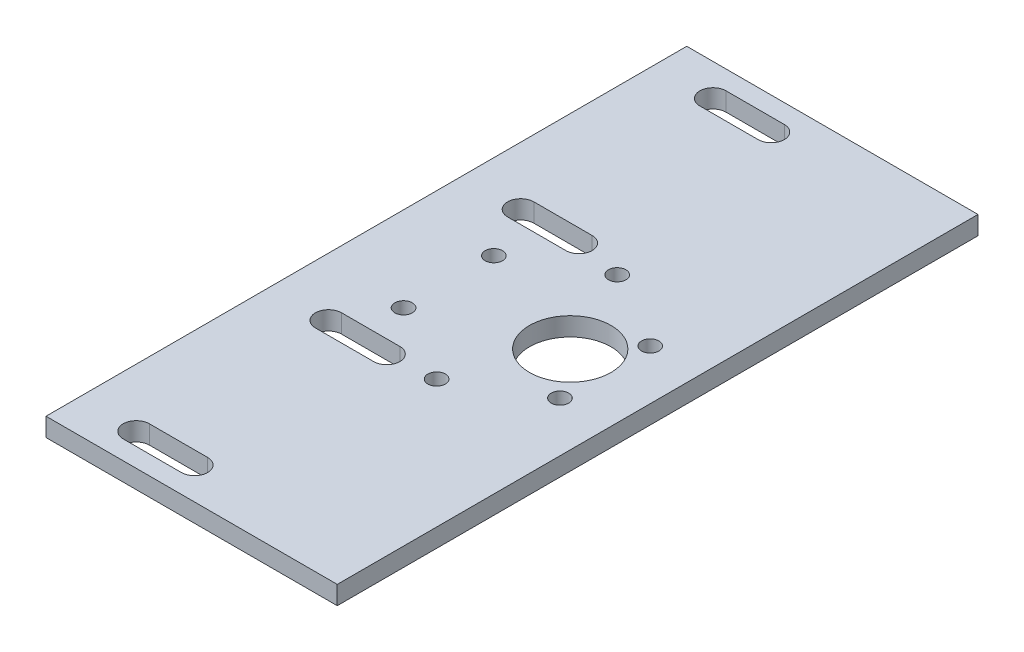
ISO-10303-21;
HEADER;
FILE_DESCRIPTION(('STEP AP214'),'2;1');
FILE_NAME('part.step','',(''),(''),'','','');
FILE_SCHEMA(('AUTOMOTIVE_DESIGN { 1 0 10303 214 1 1 1 1 }'));
ENDSEC;
DATA;
#1=APPLICATION_CONTEXT('core data for automotive mechanical design processes');
#2=APPLICATION_PROTOCOL_DEFINITION('international standard','automotive_design',2000,#1);
#3=PRODUCT_CONTEXT('',#1,'mechanical');
#4=PRODUCT('Part','Part','',(#3));
#5=PRODUCT_RELATED_PRODUCT_CATEGORY('part','',(#4));
#6=PRODUCT_DEFINITION_FORMATION('','',#4);
#7=PRODUCT_DEFINITION_CONTEXT('part definition',#1,'design');
#8=PRODUCT_DEFINITION('design','',#6,#7);
#9=PRODUCT_DEFINITION_SHAPE('','',#8);
#10=(LENGTH_UNIT() NAMED_UNIT(*) SI_UNIT(.MILLI.,.METRE.));
#11=(NAMED_UNIT(*) PLANE_ANGLE_UNIT() SI_UNIT($,.RADIAN.));
#12=(NAMED_UNIT(*) SI_UNIT($,.STERADIAN.) SOLID_ANGLE_UNIT());
#13=UNCERTAINTY_MEASURE_WITH_UNIT(LENGTH_MEASURE(1.E-05),#10,'distance_accuracy_value','');
#14=(GEOMETRIC_REPRESENTATION_CONTEXT(3) GLOBAL_UNCERTAINTY_ASSIGNED_CONTEXT((#13)) GLOBAL_UNIT_ASSIGNED_CONTEXT((#10,
#11,#12)) REPRESENTATION_CONTEXT('',''));
#15=CARTESIAN_POINT('',(0.,0.,0.));
#16=DIRECTION('',(0.,0.,1.));
#17=DIRECTION('',(1.,0.,0.));
#18=AXIS2_PLACEMENT_3D('',#15,#16,#17);
#19=CARTESIAN_POINT('',(0.,3.175,0.));
#20=DIRECTION('',(0.,-1.,0.));
#21=DIRECTION('',(0.,0.,-1.));
#22=AXIS2_PLACEMENT_3D('',#19,#20,#21);
#23=PLANE('',#22);
#24=DIRECTION('',(1.,0.,0.));
#25=VECTOR('',#24,1.);
#26=CARTESIAN_POINT('',(10.,3.175,-102.25));
#27=LINE('',#26,#25);
#28=CARTESIAN_POINT('',(10.,3.175,-102.25));
#29=VERTEX_POINT('',#28);
#30=CARTESIAN_POINT('',(20.,3.175,-102.25));
#31=VERTEX_POINT('',#30);
#32=EDGE_CURVE('E181',#29,#31,#27,.T.);
#33=ORIENTED_EDGE('',*,*,#32,.F.);
#34=CARTESIAN_POINT('',(10.,3.175,-104.5));
#35=DIRECTION('',(0.,1.,0.));
#36=DIRECTION('',(0.,0.,1.));
#37=AXIS2_PLACEMENT_3D('',#34,#35,#36);
#38=CIRCLE('',#37,2.25);
#39=CARTESIAN_POINT('',(10.,3.175,-106.75));
#40=VERTEX_POINT('',#39);
#41=EDGE_CURVE('E48',#40,#29,#38,.T.);
#42=ORIENTED_EDGE('',*,*,#41,.F.);
#43=DIRECTION('',(-1.,0.,0.));
#44=VECTOR('',#43,1.);
#45=CARTESIAN_POINT('',(10.,3.175,-106.75));
#46=LINE('',#45,#44);
#47=CARTESIAN_POINT('',(20.,3.175,-106.75));
#48=VERTEX_POINT('',#47);
#49=EDGE_CURVE('E187',#48,#40,#46,.T.);
#50=ORIENTED_EDGE('',*,*,#49,.F.);
#51=CARTESIAN_POINT('',(20.,3.175,-104.5));
#52=DIRECTION('',(0.,1.,0.));
#53=DIRECTION('',(0.,0.,1.));
#54=AXIS2_PLACEMENT_3D('',#51,#52,#53);
#55=CIRCLE('',#54,2.25);
#56=EDGE_CURVE('E172',#31,#48,#55,.T.);
#57=ORIENTED_EDGE('',*,*,#56,.F.);
#58=EDGE_LOOP('',(#33,#42,#50,#57));
#59=FACE_BOUND('',#58,.T.);
#60=DIRECTION('',(1.,0.,0.));
#61=VECTOR('',#60,1.);
#62=CARTESIAN_POINT('',(10.,3.175,-69.25));
#63=LINE('',#62,#61);
#64=CARTESIAN_POINT('',(10.,3.175,-69.25));
#65=VERTEX_POINT('',#64);
#66=CARTESIAN_POINT('',(20.,3.175,-69.25));
#67=VERTEX_POINT('',#66);
#68=EDGE_CURVE('E198',#65,#67,#63,.T.);
#69=ORIENTED_EDGE('',*,*,#68,.F.);
#70=CARTESIAN_POINT('',(10.,3.175,-71.5));
#71=DIRECTION('',(0.,1.,0.));
#72=DIRECTION('',(0.,0.,1.));
#73=AXIS2_PLACEMENT_3D('',#70,#71,#72);
#74=CIRCLE('',#73,2.25);
#75=CARTESIAN_POINT('',(10.,3.175,-73.75));
#76=VERTEX_POINT('',#75);
#77=EDGE_CURVE('E194',#76,#65,#74,.T.);
#78=ORIENTED_EDGE('',*,*,#77,.F.);
#79=DIRECTION('',(-1.,0.,0.));
#80=VECTOR('',#79,1.);
#81=CARTESIAN_POINT('',(10.,3.175,-73.75));
#82=LINE('',#81,#80);
#83=CARTESIAN_POINT('',(20.,3.175,-73.75));
#84=VERTEX_POINT('',#83);
#85=EDGE_CURVE('E204',#84,#76,#82,.T.);
#86=ORIENTED_EDGE('',*,*,#85,.F.);
#87=CARTESIAN_POINT('',(20.,3.175,-71.5));
#88=DIRECTION('',(0.,1.,0.));
#89=DIRECTION('',(0.,0.,1.));
#90=AXIS2_PLACEMENT_3D('',#87,#88,#89);
#91=CIRCLE('',#90,2.25);
#92=EDGE_CURVE('E201',#67,#84,#91,.T.);
#93=ORIENTED_EDGE('',*,*,#92,.F.);
#94=EDGE_LOOP('',(#69,#78,#86,#93));
#95=FACE_BOUND('',#94,.T.);
#96=DIRECTION('',(1.,0.,0.));
#97=VECTOR('',#96,1.);
#98=CARTESIAN_POINT('',(10.,3.175,-36.25));
#99=LINE('',#98,#97);
#100=CARTESIAN_POINT('',(10.,3.175,-36.25));
#101=VERTEX_POINT('',#100);
#102=CARTESIAN_POINT('',(20.,3.175,-36.25));
#103=VERTEX_POINT('',#102);
#104=EDGE_CURVE('E218',#101,#103,#99,.T.);
#105=ORIENTED_EDGE('',*,*,#104,.F.);
#106=CARTESIAN_POINT('',(10.,3.175,-38.5));
#107=DIRECTION('',(0.,1.,0.));
#108=DIRECTION('',(0.,0.,1.));
#109=AXIS2_PLACEMENT_3D('',#106,#107,#108);
#110=CIRCLE('',#109,2.25);
#111=CARTESIAN_POINT('',(10.,3.175,-40.75));
#112=VERTEX_POINT('',#111);
#113=EDGE_CURVE('E210',#112,#101,#110,.T.);
#114=ORIENTED_EDGE('',*,*,#113,.F.);
#115=DIRECTION('',(-1.,0.,0.));
#116=VECTOR('',#115,1.);
#117=CARTESIAN_POINT('',(10.,3.175,-40.75));
#118=LINE('',#117,#116);
#119=CARTESIAN_POINT('',(20.,3.175,-40.75));
#120=VERTEX_POINT('',#119);
#121=EDGE_CURVE('E224',#120,#112,#118,.T.);
#122=ORIENTED_EDGE('',*,*,#121,.F.);
#123=CARTESIAN_POINT('',(20.,3.175,-38.5));
#124=DIRECTION('',(0.,1.,0.));
#125=DIRECTION('',(0.,0.,1.));
#126=AXIS2_PLACEMENT_3D('',#123,#124,#125);
#127=CIRCLE('',#126,2.25);
#128=EDGE_CURVE('E221',#103,#120,#127,.T.);
#129=ORIENTED_EDGE('',*,*,#128,.F.);
#130=EDGE_LOOP('',(#105,#114,#122,#129));
#131=FACE_BOUND('',#130,.T.);
#132=DIRECTION('',(1.,0.,0.));
#133=VECTOR('',#132,1.);
#134=CARTESIAN_POINT('',(10.,3.175,-3.24999999999999));
#135=LINE('',#134,#133);
#136=CARTESIAN_POINT('',(10.,3.175,-3.24999999999999));
#137=VERTEX_POINT('',#136);
#138=CARTESIAN_POINT('',(20.,3.175,-3.24999999999999));
#139=VERTEX_POINT('',#138);
#140=EDGE_CURVE('E238',#137,#139,#135,.T.);
#141=ORIENTED_EDGE('',*,*,#140,.F.);
#142=CARTESIAN_POINT('',(10.,3.175,-5.49999999999999));
#143=DIRECTION('',(0.,1.,0.));
#144=DIRECTION('',(0.,0.,1.));
#145=AXIS2_PLACEMENT_3D('',#142,#143,#144);
#146=CIRCLE('',#145,2.25);
#147=CARTESIAN_POINT('',(10.,3.175,-7.74999999999999));
#148=VERTEX_POINT('',#147);
#149=EDGE_CURVE('E230',#148,#137,#146,.T.);
#150=ORIENTED_EDGE('',*,*,#149,.F.);
#151=DIRECTION('',(-1.,0.,0.));
#152=VECTOR('',#151,1.);
#153=CARTESIAN_POINT('',(10.,3.175,-7.74999999999999));
#154=LINE('',#153,#152);
#155=CARTESIAN_POINT('',(20.,3.175,-7.74999999999999));
#156=VERTEX_POINT('',#155);
#157=EDGE_CURVE('E244',#156,#148,#154,.T.);
#158=ORIENTED_EDGE('',*,*,#157,.F.);
#159=CARTESIAN_POINT('',(20.,3.175,-5.49999999999999));
#160=DIRECTION('',(0.,1.,0.));
#161=DIRECTION('',(0.,0.,1.));
#162=AXIS2_PLACEMENT_3D('',#159,#160,#161);
#163=CIRCLE('',#162,2.25);
#164=EDGE_CURVE('E241',#139,#156,#163,.T.);
#165=ORIENTED_EDGE('',*,*,#164,.F.);
#166=EDGE_LOOP('',(#141,#150,#158,#165));
#167=FACE_BOUND('',#166,.T.);
#168=CARTESIAN_POINT('',(14.576544408574,3.175,-46.8077912149998));
#169=DIRECTION('',(0.,1.,0.));
#170=DIRECTION('',(0.,0.,1.));
#171=AXIS2_PLACEMENT_3D('',#168,#169,#170);
#172=CIRCLE('',#171,1.5);
#173=CARTESIAN_POINT('',(14.576544408574,3.175,-45.3077912149998));
#174=VERTEX_POINT('',#173);
#175=EDGE_CURVE('E263',#174,#174,#172,.T.);
#176=ORIENTED_EDGE('',*,*,#175,.F.);
#177=EDGE_LOOP('',(#176));
#178=FACE_BOUND('',#177,.T.);
#179=CARTESIAN_POINT('',(41.4233319208557,3.175,-46.8072712165623));
#180=DIRECTION('',(0.,1.,0.));
#181=DIRECTION('',(0.,0.,1.));
#182=AXIS2_PLACEMENT_3D('',#179,#180,#181);
#183=CIRCLE('',#182,1.5);
#184=CARTESIAN_POINT('',(41.4233319208557,3.175,-45.3072712165623));
#185=VERTEX_POINT('',#184);
#186=EDGE_CURVE('E275',#185,#185,#183,.T.);
#187=ORIENTED_EDGE('',*,*,#186,.F.);
#188=EDGE_LOOP('',(#187));
#189=FACE_BOUND('',#188,.T.);
#190=CARTESIAN_POINT('',(28.0003884965716,3.175,-70.0575312114198));
#191=DIRECTION('',(0.,1.,0.));
#192=DIRECTION('',(0.,0.,1.));
#193=AXIS2_PLACEMENT_3D('',#190,#191,#192);
#194=CIRCLE('',#193,1.5);
#195=CARTESIAN_POINT('',(28.0003884965716,3.175,-68.5575312114198));
#196=VERTEX_POINT('',#195);
#197=EDGE_CURVE('E287',#196,#196,#194,.T.);
#198=ORIENTED_EDGE('',*,*,#197,.F.);
#199=EDGE_LOOP('',(#198));
#200=FACE_BOUND('',#199,.T.);
#201=DIRECTION('',(0.,0.,1.));
#202=VECTOR('',#201,1.);
#203=CARTESIAN_POINT('',(0.,3.175,0.));
#204=LINE('',#203,#202);
#205=CARTESIAN_POINT('',(0.,3.175,-110.));
#206=VERTEX_POINT('',#205);
#207=CARTESIAN_POINT('',(0.,3.175,0.));
#208=VERTEX_POINT('',#207);
#209=EDGE_CURVE('E299',#206,#208,#204,.T.);
#210=ORIENTED_EDGE('',*,*,#209,.T.);
#211=DIRECTION('',(1.,0.,0.));
#212=VECTOR('',#211,1.);
#213=CARTESIAN_POINT('',(0.,3.175,0.));
#214=LINE('',#213,#212);
#215=CARTESIAN_POINT('',(50.,3.175,0.));
#216=VERTEX_POINT('',#215);
#217=EDGE_CURVE('E302',#208,#216,#214,.T.);
#218=ORIENTED_EDGE('',*,*,#217,.T.);
#219=DIRECTION('',(0.,0.,-1.));
#220=VECTOR('',#219,1.);
#221=CARTESIAN_POINT('',(50.,3.175,0.));
#222=LINE('',#221,#220);
#223=CARTESIAN_POINT('',(50.,3.175,-110.));
#224=VERTEX_POINT('',#223);
#225=EDGE_CURVE('E305',#216,#224,#222,.T.);
#226=ORIENTED_EDGE('',*,*,#225,.T.);
#227=DIRECTION('',(-1.,0.,0.));
#228=VECTOR('',#227,1.);
#229=CARTESIAN_POINT('',(0.,3.175,-110.));
#230=LINE('',#229,#228);
#231=EDGE_CURVE('E307',#224,#206,#230,.T.);
#232=ORIENTED_EDGE('',*,*,#231,.T.);
#233=EDGE_LOOP('',(#210,#218,#226,#232));
#234=FACE_BOUND('',#233,.T.);
#235=CARTESIAN_POINT('',(35.,3.175,-55.));
#236=DIRECTION('',(0.,1.,0.));
#237=DIRECTION('',(0.,0.,1.));
#238=AXIS2_PLACEMENT_3D('',#235,#236,#237);
#239=CIRCLE('',#238,7.);
#240=CARTESIAN_POINT('',(35.,3.175,-48.));
#241=VERTEX_POINT('',#240);
#242=EDGE_CURVE('E293',#241,#241,#239,.T.);
#243=ORIENTED_EDGE('',*,*,#242,.F.);
#244=EDGE_LOOP('',(#243));
#245=FACE_BOUND('',#244,.T.);
#246=CARTESIAN_POINT('',(41.4236321420935,3.175,-62.3072712136548));
#247=DIRECTION('',(0.,1.,0.));
#248=DIRECTION('',(0.,0.,1.));
#249=AXIS2_PLACEMENT_3D('',#246,#247,#248);
#250=CIRCLE('',#249,1.5);
#251=CARTESIAN_POINT('',(41.4236321420935,3.175,-60.8072712136548));
#252=VERTEX_POINT('',#251);
#253=EDGE_CURVE('E281',#252,#252,#250,.T.);
#254=ORIENTED_EDGE('',*,*,#253,.F.);
#255=EDGE_LOOP('',(#254));
#256=FACE_BOUND('',#255,.T.);
#257=CARTESIAN_POINT('',(27.9997880540959,3.175,-39.0575312172348));
#258=DIRECTION('',(0.,1.,0.));
#259=DIRECTION('',(0.,0.,1.));
#260=AXIS2_PLACEMENT_3D('',#257,#258,#259);
#261=CIRCLE('',#260,1.5);
#262=CARTESIAN_POINT('',(27.9997880540959,3.175,-37.5575312172348));
#263=VERTEX_POINT('',#262);
#264=EDGE_CURVE('E269',#263,#263,#261,.T.);
#265=ORIENTED_EDGE('',*,*,#264,.F.);
#266=EDGE_LOOP('',(#265));
#267=FACE_BOUND('',#266,.T.);
#268=CARTESIAN_POINT('',(14.5768446298119,3.175,-62.3077912120923));
#269=DIRECTION('',(0.,1.,0.));
#270=DIRECTION('',(0.,0.,1.));
#271=AXIS2_PLACEMENT_3D('',#268,#269,#270);
#272=CIRCLE('',#271,1.5);
#273=CARTESIAN_POINT('',(14.5768446298119,3.175,-60.8077912120923));
#274=VERTEX_POINT('',#273);
#275=EDGE_CURVE('E257',#274,#274,#272,.T.);
#276=ORIENTED_EDGE('',*,*,#275,.F.);
#277=EDGE_LOOP('',(#276));
#278=FACE_BOUND('',#277,.T.);
#279=ADVANCED_FACE('F33',(#59,#95,#131,#167,#178,#189,#200,#234,#245,#256,#267,#278),#23,.F.);
#280=CARTESIAN_POINT('',(0.,0.,0.));
#281=DIRECTION('',(0.,-1.,0.));
#282=DIRECTION('',(0.,0.,-1.));
#283=AXIS2_PLACEMENT_3D('',#280,#281,#282);
#284=PLANE('',#283);
#285=CARTESIAN_POINT('',(10.,0.,-104.5));
#286=DIRECTION('',(0.,-1.,0.));
#287=DIRECTION('',(0.,0.,-1.));
#288=AXIS2_PLACEMENT_3D('',#285,#286,#287);
#289=CIRCLE('',#288,2.25);
#290=CARTESIAN_POINT('',(10.,0.,-102.25));
#291=VERTEX_POINT('',#290);
#292=CARTESIAN_POINT('',(10.,0.,-106.75));
#293=VERTEX_POINT('',#292);
#294=EDGE_CURVE('E11',#291,#293,#289,.T.);
#295=ORIENTED_EDGE('',*,*,#294,.F.);
#296=DIRECTION('',(-1.,0.,0.));
#297=VECTOR('',#296,1.);
#298=CARTESIAN_POINT('',(0.,0.,-102.25));
#299=LINE('',#298,#297);
#300=CARTESIAN_POINT('',(20.,0.,-102.25));
#301=VERTEX_POINT('',#300);
#302=EDGE_CURVE('E355',#301,#291,#299,.T.);
#303=ORIENTED_EDGE('',*,*,#302,.F.);
#304=CARTESIAN_POINT('',(20.,0.,-104.5));
#305=DIRECTION('',(0.,-1.,0.));
#306=DIRECTION('',(0.,0.,-1.));
#307=AXIS2_PLACEMENT_3D('',#304,#305,#306);
#308=CIRCLE('',#307,2.25);
#309=CARTESIAN_POINT('',(20.,0.,-106.75));
#310=VERTEX_POINT('',#309);
#311=EDGE_CURVE('E175',#310,#301,#308,.T.);
#312=ORIENTED_EDGE('',*,*,#311,.F.);
#313=DIRECTION('',(1.,0.,0.));
#314=VECTOR('',#313,1.);
#315=CARTESIAN_POINT('',(0.,0.,-106.75));
#316=LINE('',#315,#314);
#317=EDGE_CURVE('E41',#293,#310,#316,.T.);
#318=ORIENTED_EDGE('',*,*,#317,.F.);
#319=EDGE_LOOP('',(#295,#303,#312,#318));
#320=FACE_BOUND('',#319,.T.);
#321=CARTESIAN_POINT('',(10.,0.,-71.5));
#322=DIRECTION('',(0.,-1.,0.));
#323=DIRECTION('',(0.,0.,-1.));
#324=AXIS2_PLACEMENT_3D('',#321,#322,#323);
#325=CIRCLE('',#324,2.25);
#326=CARTESIAN_POINT('',(10.,0.,-69.25));
#327=VERTEX_POINT('',#326);
#328=CARTESIAN_POINT('',(10.,0.,-73.75));
#329=VERTEX_POINT('',#328);
#330=EDGE_CURVE('E353',#327,#329,#325,.T.);
#331=ORIENTED_EDGE('',*,*,#330,.F.);
#332=DIRECTION('',(-1.,0.,0.));
#333=VECTOR('',#332,1.);
#334=CARTESIAN_POINT('',(0.,0.,-69.25));
#335=LINE('',#334,#333);
#336=CARTESIAN_POINT('',(20.,0.,-69.25));
#337=VERTEX_POINT('',#336);
#338=EDGE_CURVE('E346',#337,#327,#335,.T.);
#339=ORIENTED_EDGE('',*,*,#338,.F.);
#340=CARTESIAN_POINT('',(20.,0.,-71.5));
#341=DIRECTION('',(0.,-1.,0.));
#342=DIRECTION('',(0.,0.,-1.));
#343=AXIS2_PLACEMENT_3D('',#340,#341,#342);
#344=CIRCLE('',#343,2.25);
#345=CARTESIAN_POINT('',(20.,0.,-73.75));
#346=VERTEX_POINT('',#345);
#347=EDGE_CURVE('E348',#346,#337,#344,.T.);
#348=ORIENTED_EDGE('',*,*,#347,.F.);
#349=DIRECTION('',(1.,0.,0.));
#350=VECTOR('',#349,1.);
#351=CARTESIAN_POINT('',(0.,0.,-73.75));
#352=LINE('',#351,#350);
#353=EDGE_CURVE('E351',#329,#346,#352,.T.);
#354=ORIENTED_EDGE('',*,*,#353,.F.);
#355=EDGE_LOOP('',(#331,#339,#348,#354));
#356=FACE_BOUND('',#355,.T.);
#357=CARTESIAN_POINT('',(10.,0.,-38.5));
#358=DIRECTION('',(0.,-1.,0.));
#359=DIRECTION('',(0.,0.,-1.));
#360=AXIS2_PLACEMENT_3D('',#357,#358,#359);
#361=CIRCLE('',#360,2.25);
#362=CARTESIAN_POINT('',(10.,0.,-36.25));
#363=VERTEX_POINT('',#362);
#364=CARTESIAN_POINT('',(10.,0.,-40.75));
#365=VERTEX_POINT('',#364);
#366=EDGE_CURVE('E344',#363,#365,#361,.T.);
#367=ORIENTED_EDGE('',*,*,#366,.F.);
#368=DIRECTION('',(-1.,0.,0.));
#369=VECTOR('',#368,1.);
#370=CARTESIAN_POINT('',(0.,0.,-36.25));
#371=LINE('',#370,#369);
#372=CARTESIAN_POINT('',(20.,0.,-36.25));
#373=VERTEX_POINT('',#372);
#374=EDGE_CURVE('E337',#373,#363,#371,.T.);
#375=ORIENTED_EDGE('',*,*,#374,.F.);
#376=CARTESIAN_POINT('',(20.,0.,-38.5));
#377=DIRECTION('',(0.,-1.,0.));
#378=DIRECTION('',(0.,0.,-1.));
#379=AXIS2_PLACEMENT_3D('',#376,#377,#378);
#380=CIRCLE('',#379,2.25);
#381=CARTESIAN_POINT('',(20.,0.,-40.75));
#382=VERTEX_POINT('',#381);
#383=EDGE_CURVE('E339',#382,#373,#380,.T.);
#384=ORIENTED_EDGE('',*,*,#383,.F.);
#385=DIRECTION('',(1.,0.,0.));
#386=VECTOR('',#385,1.);
#387=CARTESIAN_POINT('',(0.,0.,-40.75));
#388=LINE('',#387,#386);
#389=EDGE_CURVE('E342',#365,#382,#388,.T.);
#390=ORIENTED_EDGE('',*,*,#389,.F.);
#391=EDGE_LOOP('',(#367,#375,#384,#390));
#392=FACE_BOUND('',#391,.T.);
#393=CARTESIAN_POINT('',(10.,0.,-5.49999999999999));
#394=DIRECTION('',(0.,-1.,0.));
#395=DIRECTION('',(0.,0.,-1.));
#396=AXIS2_PLACEMENT_3D('',#393,#394,#395);
#397=CIRCLE('',#396,2.25);
#398=CARTESIAN_POINT('',(10.,0.,-3.24999999999999));
#399=VERTEX_POINT('',#398);
#400=CARTESIAN_POINT('',(10.,0.,-7.74999999999999));
#401=VERTEX_POINT('',#400);
#402=EDGE_CURVE('E335',#399,#401,#397,.T.);
#403=ORIENTED_EDGE('',*,*,#402,.F.);
#404=DIRECTION('',(-1.,0.,0.));
#405=VECTOR('',#404,1.);
#406=CARTESIAN_POINT('',(0.,0.,-3.24999999999999));
#407=LINE('',#406,#405);
#408=CARTESIAN_POINT('',(20.,0.,-3.24999999999999));
#409=VERTEX_POINT('',#408);
#410=EDGE_CURVE('E328',#409,#399,#407,.T.);
#411=ORIENTED_EDGE('',*,*,#410,.F.);
#412=CARTESIAN_POINT('',(20.,0.,-5.49999999999999));
#413=DIRECTION('',(0.,-1.,0.));
#414=DIRECTION('',(0.,0.,-1.));
#415=AXIS2_PLACEMENT_3D('',#412,#413,#414);
#416=CIRCLE('',#415,2.25);
#417=CARTESIAN_POINT('',(20.,0.,-7.74999999999999));
#418=VERTEX_POINT('',#417);
#419=EDGE_CURVE('E330',#418,#409,#416,.T.);
#420=ORIENTED_EDGE('',*,*,#419,.F.);
#421=DIRECTION('',(1.,0.,0.));
#422=VECTOR('',#421,1.);
#423=CARTESIAN_POINT('',(0.,0.,-7.74999999999999));
#424=LINE('',#423,#422);
#425=EDGE_CURVE('E333',#401,#418,#424,.T.);
#426=ORIENTED_EDGE('',*,*,#425,.F.);
#427=EDGE_LOOP('',(#403,#411,#420,#426));
#428=FACE_BOUND('',#427,.T.);
#429=CARTESIAN_POINT('',(14.576544408574,0.,-46.8077912149998));
#430=DIRECTION('',(0.,1.,0.));
#431=DIRECTION('',(0.,0.,1.));
#432=AXIS2_PLACEMENT_3D('',#429,#430,#431);
#433=CIRCLE('',#432,1.5);
#434=CARTESIAN_POINT('',(14.576544408574,0.,-45.3077912149998));
#435=VERTEX_POINT('',#434);
#436=EDGE_CURVE('E260',#435,#435,#433,.T.);
#437=ORIENTED_EDGE('',*,*,#436,.T.);
#438=EDGE_LOOP('',(#437));
#439=FACE_BOUND('',#438,.T.);
#440=CARTESIAN_POINT('',(41.4233319208557,0.,-46.8072712165623));
#441=DIRECTION('',(0.,1.,0.));
#442=DIRECTION('',(0.,0.,1.));
#443=AXIS2_PLACEMENT_3D('',#440,#441,#442);
#444=CIRCLE('',#443,1.5);
#445=CARTESIAN_POINT('',(41.4233319208557,0.,-45.3072712165623));
#446=VERTEX_POINT('',#445);
#447=EDGE_CURVE('E272',#446,#446,#444,.T.);
#448=ORIENTED_EDGE('',*,*,#447,.T.);
#449=EDGE_LOOP('',(#448));
#450=FACE_BOUND('',#449,.T.);
#451=CARTESIAN_POINT('',(28.0003884965716,0.,-70.0575312114198));
#452=DIRECTION('',(0.,1.,0.));
#453=DIRECTION('',(0.,0.,1.));
#454=AXIS2_PLACEMENT_3D('',#451,#452,#453);
#455=CIRCLE('',#454,1.5);
#456=CARTESIAN_POINT('',(28.0003884965716,0.,-68.5575312114198));
#457=VERTEX_POINT('',#456);
#458=EDGE_CURVE('E284',#457,#457,#455,.T.);
#459=ORIENTED_EDGE('',*,*,#458,.T.);
#460=EDGE_LOOP('',(#459));
#461=FACE_BOUND('',#460,.T.);
#462=DIRECTION('',(0.,0.,1.));
#463=VECTOR('',#462,1.);
#464=CARTESIAN_POINT('',(0.,0.,0.));
#465=LINE('',#464,#463);
#466=CARTESIAN_POINT('',(0.,0.,-110.));
#467=VERTEX_POINT('',#466);
#468=CARTESIAN_POINT('',(0.,0.,0.));
#469=VERTEX_POINT('',#468);
#470=EDGE_CURVE('E296',#467,#469,#465,.T.);
#471=ORIENTED_EDGE('',*,*,#470,.F.);
#472=DIRECTION('',(-1.,0.,0.));
#473=VECTOR('',#472,1.);
#474=CARTESIAN_POINT('',(0.,0.,-110.));
#475=LINE('',#474,#473);
#476=CARTESIAN_POINT('',(50.,0.,-110.));
#477=VERTEX_POINT('',#476);
#478=EDGE_CURVE('E303',#477,#467,#475,.T.);
#479=ORIENTED_EDGE('',*,*,#478,.F.);
#480=DIRECTION('',(0.,0.,-1.));
#481=VECTOR('',#480,1.);
#482=CARTESIAN_POINT('',(50.,0.,0.));
#483=LINE('',#482,#481);
#484=CARTESIAN_POINT('',(50.,0.,0.));
#485=VERTEX_POINT('',#484);
#486=EDGE_CURVE('E314',#485,#477,#483,.T.);
#487=ORIENTED_EDGE('',*,*,#486,.F.);
#488=DIRECTION('',(1.,0.,0.));
#489=VECTOR('',#488,1.);
#490=CARTESIAN_POINT('',(0.,0.,0.));
#491=LINE('',#490,#489);
#492=EDGE_CURVE('E312',#469,#485,#491,.T.);
#493=ORIENTED_EDGE('',*,*,#492,.F.);
#494=EDGE_LOOP('',(#471,#479,#487,#493));
#495=FACE_BOUND('',#494,.T.);
#496=CARTESIAN_POINT('',(35.,0.,-55.));
#497=DIRECTION('',(0.,1.,0.));
#498=DIRECTION('',(0.,0.,1.));
#499=AXIS2_PLACEMENT_3D('',#496,#497,#498);
#500=CIRCLE('',#499,7.);
#501=CARTESIAN_POINT('',(35.,0.,-48.));
#502=VERTEX_POINT('',#501);
#503=EDGE_CURVE('E290',#502,#502,#500,.T.);
#504=ORIENTED_EDGE('',*,*,#503,.T.);
#505=EDGE_LOOP('',(#504));
#506=FACE_BOUND('',#505,.T.);
#507=CARTESIAN_POINT('',(41.4236321420935,0.,-62.3072712136548));
#508=DIRECTION('',(0.,1.,0.));
#509=DIRECTION('',(0.,0.,1.));
#510=AXIS2_PLACEMENT_3D('',#507,#508,#509);
#511=CIRCLE('',#510,1.5);
#512=CARTESIAN_POINT('',(41.4236321420935,0.,-60.8072712136548));
#513=VERTEX_POINT('',#512);
#514=EDGE_CURVE('E278',#513,#513,#511,.T.);
#515=ORIENTED_EDGE('',*,*,#514,.T.);
#516=EDGE_LOOP('',(#515));
#517=FACE_BOUND('',#516,.T.);
#518=CARTESIAN_POINT('',(27.9997880540959,0.,-39.0575312172348));
#519=DIRECTION('',(0.,1.,0.));
#520=DIRECTION('',(0.,0.,1.));
#521=AXIS2_PLACEMENT_3D('',#518,#519,#520);
#522=CIRCLE('',#521,1.5);
#523=CARTESIAN_POINT('',(27.9997880540959,0.,-37.5575312172348));
#524=VERTEX_POINT('',#523);
#525=EDGE_CURVE('E266',#524,#524,#522,.T.);
#526=ORIENTED_EDGE('',*,*,#525,.T.);
#527=EDGE_LOOP('',(#526));
#528=FACE_BOUND('',#527,.T.);
#529=CARTESIAN_POINT('',(14.5768446298119,0.,-62.3077912120923));
#530=DIRECTION('',(0.,1.,0.));
#531=DIRECTION('',(0.,0.,1.));
#532=AXIS2_PLACEMENT_3D('',#529,#530,#531);
#533=CIRCLE('',#532,1.5);
#534=CARTESIAN_POINT('',(14.5768446298119,0.,-60.8077912120923));
#535=VERTEX_POINT('',#534);
#536=EDGE_CURVE('E250',#535,#535,#533,.T.);
#537=ORIENTED_EDGE('',*,*,#536,.T.);
#538=EDGE_LOOP('',(#537));
#539=FACE_BOUND('',#538,.T.);
#540=ADVANCED_FACE('F363',(#320,#356,#392,#428,#439,#450,#461,#495,#506,#517,#528,#539),#284,.T.);
#541=CARTESIAN_POINT('',(0.,3.175,0.));
#542=DIRECTION('',(1.,0.,0.));
#543=DIRECTION('',(0.,0.,-1.));
#544=AXIS2_PLACEMENT_3D('',#541,#542,#543);
#545=PLANE('',#544);
#546=ORIENTED_EDGE('',*,*,#470,.T.);
#547=DIRECTION('',(0.,-1.,0.));
#548=VECTOR('',#547,1.);
#549=CARTESIAN_POINT('',(0.,3.175,0.));
#550=LINE('',#549,#548);
#551=EDGE_CURVE('E325',#208,#469,#550,.T.);
#552=ORIENTED_EDGE('',*,*,#551,.F.);
#553=ORIENTED_EDGE('',*,*,#209,.F.);
#554=DIRECTION('',(0.,-1.,0.));
#555=VECTOR('',#554,1.);
#556=CARTESIAN_POINT('',(0.,3.175,-110.));
#557=LINE('',#556,#555);
#558=EDGE_CURVE('E309',#206,#467,#557,.T.);
#559=ORIENTED_EDGE('',*,*,#558,.T.);
#560=EDGE_LOOP('',(#546,#552,#553,#559));
#561=FACE_BOUND('',#560,.T.);
#562=ADVANCED_FACE('F35',(#561),#545,.F.);
#563=CARTESIAN_POINT('',(0.,3.175,0.));
#564=DIRECTION('',(0.,0.,-1.));
#565=DIRECTION('',(-1.,0.,0.));
#566=AXIS2_PLACEMENT_3D('',#563,#564,#565);
#567=PLANE('',#566);
#568=ORIENTED_EDGE('',*,*,#492,.T.);
#569=DIRECTION('',(0.,-1.,0.));
#570=VECTOR('',#569,1.);
#571=CARTESIAN_POINT('',(50.,3.175,0.));
#572=LINE('',#571,#570);
#573=EDGE_CURVE('E322',#216,#485,#572,.T.);
#574=ORIENTED_EDGE('',*,*,#573,.F.);
#575=ORIENTED_EDGE('',*,*,#217,.F.);
#576=ORIENTED_EDGE('',*,*,#551,.T.);
#577=EDGE_LOOP('',(#568,#574,#575,#576));
#578=FACE_BOUND('',#577,.T.);
#579=ADVANCED_FACE('F396',(#578),#567,.F.);
#580=CARTESIAN_POINT('',(50.,3.175,0.));
#581=DIRECTION('',(-1.,0.,0.));
#582=DIRECTION('',(0.,0.,1.));
#583=AXIS2_PLACEMENT_3D('',#580,#581,#582);
#584=PLANE('',#583);
#585=ORIENTED_EDGE('',*,*,#486,.T.);
#586=DIRECTION('',(0.,-1.,0.));
#587=VECTOR('',#586,1.);
#588=CARTESIAN_POINT('',(50.,3.175,-110.));
#589=LINE('',#588,#587);
#590=EDGE_CURVE('E319',#224,#477,#589,.T.);
#591=ORIENTED_EDGE('',*,*,#590,.F.);
#592=ORIENTED_EDGE('',*,*,#225,.F.);
#593=ORIENTED_EDGE('',*,*,#573,.T.);
#594=EDGE_LOOP('',(#585,#591,#592,#593));
#595=FACE_BOUND('',#594,.T.);
#596=ADVANCED_FACE('F393',(#595),#584,.F.);
#597=CARTESIAN_POINT('',(0.,3.175,-110.));
#598=DIRECTION('',(0.,0.,1.));
#599=DIRECTION('',(1.,0.,0.));
#600=AXIS2_PLACEMENT_3D('',#597,#598,#599);
#601=PLANE('',#600);
#602=ORIENTED_EDGE('',*,*,#478,.T.);
#603=ORIENTED_EDGE('',*,*,#558,.F.);
#604=ORIENTED_EDGE('',*,*,#231,.F.);
#605=ORIENTED_EDGE('',*,*,#590,.T.);
#606=EDGE_LOOP('',(#602,#603,#604,#605));
#607=FACE_BOUND('',#606,.T.);
#608=ADVANCED_FACE('F390',(#607),#601,.F.);
#609=CARTESIAN_POINT('',(35.,3.175,-55.));
#610=DIRECTION('',(0.,-1.,0.));
#611=DIRECTION('',(0.,0.,-1.));
#612=AXIS2_PLACEMENT_3D('',#609,#610,#611);
#613=CYLINDRICAL_SURFACE('',#612,7.);
#614=ORIENTED_EDGE('',*,*,#242,.T.);
#615=EDGE_LOOP('',(#614));
#616=FACE_BOUND('',#615,.T.);
#617=ORIENTED_EDGE('',*,*,#503,.F.);
#618=EDGE_LOOP('',(#617));
#619=FACE_BOUND('',#618,.T.);
#620=ADVANCED_FACE('F387',(#616,#619),#613,.F.);
#621=CARTESIAN_POINT('',(28.0003884965716,3.175,-70.0575312114198));
#622=DIRECTION('',(0.,-1.,0.));
#623=DIRECTION('',(0.,0.,-1.));
#624=AXIS2_PLACEMENT_3D('',#621,#622,#623);
#625=CYLINDRICAL_SURFACE('',#624,1.5);
#626=ORIENTED_EDGE('',*,*,#197,.T.);
#627=EDGE_LOOP('',(#626));
#628=FACE_BOUND('',#627,.T.);
#629=ORIENTED_EDGE('',*,*,#458,.F.);
#630=EDGE_LOOP('',(#629));
#631=FACE_BOUND('',#630,.T.);
#632=ADVANCED_FACE('F454',(#628,#631),#625,.F.);
#633=CARTESIAN_POINT('',(41.4236321420935,3.175,-62.3072712136548));
#634=DIRECTION('',(0.,-1.,0.));
#635=DIRECTION('',(0.,0.,-1.));
#636=AXIS2_PLACEMENT_3D('',#633,#634,#635);
#637=CYLINDRICAL_SURFACE('',#636,1.5);
#638=ORIENTED_EDGE('',*,*,#253,.T.);
#639=EDGE_LOOP('',(#638));
#640=FACE_BOUND('',#639,.T.);
#641=ORIENTED_EDGE('',*,*,#514,.F.);
#642=EDGE_LOOP('',(#641));
#643=FACE_BOUND('',#642,.T.);
#644=ADVANCED_FACE('F451',(#640,#643),#637,.F.);
#645=CARTESIAN_POINT('',(41.4233319208557,3.175,-46.8072712165623));
#646=DIRECTION('',(0.,-1.,0.));
#647=DIRECTION('',(0.,0.,-1.));
#648=AXIS2_PLACEMENT_3D('',#645,#646,#647);
#649=CYLINDRICAL_SURFACE('',#648,1.5);
#650=ORIENTED_EDGE('',*,*,#186,.T.);
#651=EDGE_LOOP('',(#650));
#652=FACE_BOUND('',#651,.T.);
#653=ORIENTED_EDGE('',*,*,#447,.F.);
#654=EDGE_LOOP('',(#653));
#655=FACE_BOUND('',#654,.T.);
#656=ADVANCED_FACE('F447',(#652,#655),#649,.F.);
#657=CARTESIAN_POINT('',(27.9997880540959,3.175,-39.0575312172348));
#658=DIRECTION('',(0.,-1.,0.));
#659=DIRECTION('',(0.,0.,-1.));
#660=AXIS2_PLACEMENT_3D('',#657,#658,#659);
#661=CYLINDRICAL_SURFACE('',#660,1.5);
#662=ORIENTED_EDGE('',*,*,#264,.T.);
#663=EDGE_LOOP('',(#662));
#664=FACE_BOUND('',#663,.T.);
#665=ORIENTED_EDGE('',*,*,#525,.F.);
#666=EDGE_LOOP('',(#665));
#667=FACE_BOUND('',#666,.T.);
#668=ADVANCED_FACE('F440',(#664,#667),#661,.F.);
#669=CARTESIAN_POINT('',(14.576544408574,3.175,-46.8077912149998));
#670=DIRECTION('',(0.,-1.,0.));
#671=DIRECTION('',(0.,0.,-1.));
#672=AXIS2_PLACEMENT_3D('',#669,#670,#671);
#673=CYLINDRICAL_SURFACE('',#672,1.5);
#674=ORIENTED_EDGE('',*,*,#175,.T.);
#675=EDGE_LOOP('',(#674));
#676=FACE_BOUND('',#675,.T.);
#677=ORIENTED_EDGE('',*,*,#436,.F.);
#678=EDGE_LOOP('',(#677));
#679=FACE_BOUND('',#678,.T.);
#680=ADVANCED_FACE('F430',(#676,#679),#673,.F.);
#681=CARTESIAN_POINT('',(14.5768446298119,3.175,-62.3077912120923));
#682=DIRECTION('',(0.,-1.,0.));
#683=DIRECTION('',(0.,0.,-1.));
#684=AXIS2_PLACEMENT_3D('',#681,#682,#683);
#685=CYLINDRICAL_SURFACE('',#684,1.5);
#686=ORIENTED_EDGE('',*,*,#275,.T.);
#687=EDGE_LOOP('',(#686));
#688=FACE_BOUND('',#687,.T.);
#689=ORIENTED_EDGE('',*,*,#536,.F.);
#690=EDGE_LOOP('',(#689));
#691=FACE_BOUND('',#690,.T.);
#692=ADVANCED_FACE('F426',(#688,#691),#685,.F.);
#693=CARTESIAN_POINT('',(10.,-6.825,-5.49999999999999));
#694=DIRECTION('',(0.,1.,0.));
#695=DIRECTION('',(0.,0.,1.));
#696=AXIS2_PLACEMENT_3D('',#693,#694,#695);
#697=CYLINDRICAL_SURFACE('',#696,2.25);
#698=ORIENTED_EDGE('',*,*,#402,.T.);
#699=DIRECTION('',(0.,1.,0.));
#700=VECTOR('',#699,1.);
#701=CARTESIAN_POINT('',(10.,-6.825,-7.74999999999999));
#702=LINE('',#701,#700);
#703=EDGE_CURVE('E248',#401,#148,#702,.T.);
#704=ORIENTED_EDGE('',*,*,#703,.T.);
#705=ORIENTED_EDGE('',*,*,#149,.T.);
#706=DIRECTION('',(0.,1.,0.));
#707=VECTOR('',#706,1.);
#708=CARTESIAN_POINT('',(10.,-6.825,-3.24999999999999));
#709=LINE('',#708,#707);
#710=EDGE_CURVE('E247',#399,#137,#709,.T.);
#711=ORIENTED_EDGE('',*,*,#710,.F.);
#712=EDGE_LOOP('',(#698,#704,#705,#711));
#713=FACE_BOUND('',#712,.T.);
#714=ADVANCED_FACE('F429',(#713),#697,.F.);
#715=CARTESIAN_POINT('',(10.,-6.825,-7.74999999999999));
#716=DIRECTION('',(0.,0.,-1.));
#717=DIRECTION('',(-1.,0.,0.));
#718=AXIS2_PLACEMENT_3D('',#715,#716,#717);
#719=PLANE('',#718);
#720=ORIENTED_EDGE('',*,*,#425,.T.);
#721=DIRECTION('',(0.,1.,0.));
#722=VECTOR('',#721,1.);
#723=CARTESIAN_POINT('',(20.,-6.825,-7.74999999999999));
#724=LINE('',#723,#722);
#725=EDGE_CURVE('E251',#418,#156,#724,.T.);
#726=ORIENTED_EDGE('',*,*,#725,.T.);
#727=ORIENTED_EDGE('',*,*,#157,.T.);
#728=ORIENTED_EDGE('',*,*,#703,.F.);
#729=EDGE_LOOP('',(#720,#726,#727,#728));
#730=FACE_BOUND('',#729,.T.);
#731=ADVANCED_FACE('F437',(#730),#719,.F.);
#732=CARTESIAN_POINT('',(20.,-6.825,-5.49999999999999));
#733=DIRECTION('',(0.,1.,0.));
#734=DIRECTION('',(0.,0.,1.));
#735=AXIS2_PLACEMENT_3D('',#732,#733,#734);
#736=CYLINDRICAL_SURFACE('',#735,2.25);
#737=ORIENTED_EDGE('',*,*,#419,.T.);
#738=DIRECTION('',(0.,1.,0.));
#739=VECTOR('',#738,1.);
#740=CARTESIAN_POINT('',(20.,-6.825,-3.24999999999999));
#741=LINE('',#740,#739);
#742=EDGE_CURVE('E253',#409,#139,#741,.T.);
#743=ORIENTED_EDGE('',*,*,#742,.T.);
#744=ORIENTED_EDGE('',*,*,#164,.T.);
#745=ORIENTED_EDGE('',*,*,#725,.F.);
#746=EDGE_LOOP('',(#737,#743,#744,#745));
#747=FACE_BOUND('',#746,.T.);
#748=ADVANCED_FACE('F521',(#747),#736,.F.);
#749=CARTESIAN_POINT('',(10.,-6.825,-3.24999999999999));
#750=DIRECTION('',(0.,0.,1.));
#751=DIRECTION('',(1.,0.,0.));
#752=AXIS2_PLACEMENT_3D('',#749,#750,#751);
#753=PLANE('',#752);
#754=ORIENTED_EDGE('',*,*,#410,.T.);
#755=ORIENTED_EDGE('',*,*,#710,.T.);
#756=ORIENTED_EDGE('',*,*,#140,.T.);
#757=ORIENTED_EDGE('',*,*,#742,.F.);
#758=EDGE_LOOP('',(#754,#755,#756,#757));
#759=FACE_BOUND('',#758,.T.);
#760=ADVANCED_FACE('F531',(#759),#753,.F.);
#761=CARTESIAN_POINT('',(10.,-6.825,-38.5));
#762=DIRECTION('',(0.,1.,0.));
#763=DIRECTION('',(0.,0.,1.));
#764=AXIS2_PLACEMENT_3D('',#761,#762,#763);
#765=CYLINDRICAL_SURFACE('',#764,2.25);
#766=ORIENTED_EDGE('',*,*,#366,.T.);
#767=DIRECTION('',(0.,1.,0.));
#768=VECTOR('',#767,1.);
#769=CARTESIAN_POINT('',(10.,-6.825,-40.75));
#770=LINE('',#769,#768);
#771=EDGE_CURVE('E228',#365,#112,#770,.T.);
#772=ORIENTED_EDGE('',*,*,#771,.T.);
#773=ORIENTED_EDGE('',*,*,#113,.T.);
#774=DIRECTION('',(0.,1.,0.));
#775=VECTOR('',#774,1.);
#776=CARTESIAN_POINT('',(10.,-6.825,-36.25));
#777=LINE('',#776,#775);
#778=EDGE_CURVE('E227',#363,#101,#777,.T.);
#779=ORIENTED_EDGE('',*,*,#778,.F.);
#780=EDGE_LOOP('',(#766,#772,#773,#779));
#781=FACE_BOUND('',#780,.T.);
#782=ADVANCED_FACE('F541',(#781),#765,.F.);
#783=CARTESIAN_POINT('',(10.,-6.825,-40.75));
#784=DIRECTION('',(0.,0.,-1.));
#785=DIRECTION('',(-1.,0.,0.));
#786=AXIS2_PLACEMENT_3D('',#783,#784,#785);
#787=PLANE('',#786);
#788=ORIENTED_EDGE('',*,*,#389,.T.);
#789=DIRECTION('',(0.,1.,0.));
#790=VECTOR('',#789,1.);
#791=CARTESIAN_POINT('',(20.,-6.825,-40.75));
#792=LINE('',#791,#790);
#793=EDGE_CURVE('E231',#382,#120,#792,.T.);
#794=ORIENTED_EDGE('',*,*,#793,.T.);
#795=ORIENTED_EDGE('',*,*,#121,.T.);
#796=ORIENTED_EDGE('',*,*,#771,.F.);
#797=EDGE_LOOP('',(#788,#794,#795,#796));
#798=FACE_BOUND('',#797,.T.);
#799=ADVANCED_FACE('F550',(#798),#787,.F.);
#800=CARTESIAN_POINT('',(20.,-6.825,-38.5));
#801=DIRECTION('',(0.,1.,0.));
#802=DIRECTION('',(0.,0.,1.));
#803=AXIS2_PLACEMENT_3D('',#800,#801,#802);
#804=CYLINDRICAL_SURFACE('',#803,2.25);
#805=ORIENTED_EDGE('',*,*,#383,.T.);
#806=DIRECTION('',(0.,1.,0.));
#807=VECTOR('',#806,1.);
#808=CARTESIAN_POINT('',(20.,-6.825,-36.25));
#809=LINE('',#808,#807);
#810=EDGE_CURVE('E233',#373,#103,#809,.T.);
#811=ORIENTED_EDGE('',*,*,#810,.T.);
#812=ORIENTED_EDGE('',*,*,#128,.T.);
#813=ORIENTED_EDGE('',*,*,#793,.F.);
#814=EDGE_LOOP('',(#805,#811,#812,#813));
#815=FACE_BOUND('',#814,.T.);
#816=ADVANCED_FACE('F560',(#815),#804,.F.);
#817=CARTESIAN_POINT('',(10.,-6.825,-36.25));
#818=DIRECTION('',(0.,0.,1.));
#819=DIRECTION('',(1.,0.,0.));
#820=AXIS2_PLACEMENT_3D('',#817,#818,#819);
#821=PLANE('',#820);
#822=ORIENTED_EDGE('',*,*,#374,.T.);
#823=ORIENTED_EDGE('',*,*,#778,.T.);
#824=ORIENTED_EDGE('',*,*,#104,.T.);
#825=ORIENTED_EDGE('',*,*,#810,.F.);
#826=EDGE_LOOP('',(#822,#823,#824,#825));
#827=FACE_BOUND('',#826,.T.);
#828=ADVANCED_FACE('F570',(#827),#821,.F.);
#829=CARTESIAN_POINT('',(10.,-6.825,-71.5));
#830=DIRECTION('',(0.,1.,0.));
#831=DIRECTION('',(0.,0.,1.));
#832=AXIS2_PLACEMENT_3D('',#829,#830,#831);
#833=CYLINDRICAL_SURFACE('',#832,2.25);
#834=ORIENTED_EDGE('',*,*,#330,.T.);
#835=DIRECTION('',(0.,1.,0.));
#836=VECTOR('',#835,1.);
#837=CARTESIAN_POINT('',(10.,-6.825,-73.75));
#838=LINE('',#837,#836);
#839=EDGE_CURVE('E208',#329,#76,#838,.T.);
#840=ORIENTED_EDGE('',*,*,#839,.T.);
#841=ORIENTED_EDGE('',*,*,#77,.T.);
#842=DIRECTION('',(0.,1.,0.));
#843=VECTOR('',#842,1.);
#844=CARTESIAN_POINT('',(10.,-6.825,-69.25));
#845=LINE('',#844,#843);
#846=EDGE_CURVE('E207',#327,#65,#845,.T.);
#847=ORIENTED_EDGE('',*,*,#846,.F.);
#848=EDGE_LOOP('',(#834,#840,#841,#847));
#849=FACE_BOUND('',#848,.T.);
#850=ADVANCED_FACE('F580',(#849),#833,.F.);
#851=CARTESIAN_POINT('',(10.,-6.825,-73.75));
#852=DIRECTION('',(0.,0.,-1.));
#853=DIRECTION('',(-1.,0.,0.));
#854=AXIS2_PLACEMENT_3D('',#851,#852,#853);
#855=PLANE('',#854);
#856=ORIENTED_EDGE('',*,*,#353,.T.);
#857=DIRECTION('',(0.,1.,0.));
#858=VECTOR('',#857,1.);
#859=CARTESIAN_POINT('',(20.,-6.825,-73.75));
#860=LINE('',#859,#858);
#861=EDGE_CURVE('E211',#346,#84,#860,.T.);
#862=ORIENTED_EDGE('',*,*,#861,.T.);
#863=ORIENTED_EDGE('',*,*,#85,.T.);
#864=ORIENTED_EDGE('',*,*,#839,.F.);
#865=EDGE_LOOP('',(#856,#862,#863,#864));
#866=FACE_BOUND('',#865,.T.);
#867=ADVANCED_FACE('F590',(#866),#855,.F.);
#868=CARTESIAN_POINT('',(20.,-6.825,-71.5));
#869=DIRECTION('',(0.,1.,0.));
#870=DIRECTION('',(0.,0.,1.));
#871=AXIS2_PLACEMENT_3D('',#868,#869,#870);
#872=CYLINDRICAL_SURFACE('',#871,2.25);
#873=ORIENTED_EDGE('',*,*,#347,.T.);
#874=DIRECTION('',(0.,1.,0.));
#875=VECTOR('',#874,1.);
#876=CARTESIAN_POINT('',(20.,-6.825,-69.25));
#877=LINE('',#876,#875);
#878=EDGE_CURVE('E213',#337,#67,#877,.T.);
#879=ORIENTED_EDGE('',*,*,#878,.T.);
#880=ORIENTED_EDGE('',*,*,#92,.T.);
#881=ORIENTED_EDGE('',*,*,#861,.F.);
#882=EDGE_LOOP('',(#873,#879,#880,#881));
#883=FACE_BOUND('',#882,.T.);
#884=ADVANCED_FACE('F374',(#883),#872,.F.);
#885=CARTESIAN_POINT('',(10.,-6.825,-69.25));
#886=DIRECTION('',(0.,0.,1.));
#887=DIRECTION('',(1.,0.,0.));
#888=AXIS2_PLACEMENT_3D('',#885,#886,#887);
#889=PLANE('',#888);
#890=ORIENTED_EDGE('',*,*,#338,.T.);
#891=ORIENTED_EDGE('',*,*,#846,.T.);
#892=ORIENTED_EDGE('',*,*,#68,.T.);
#893=ORIENTED_EDGE('',*,*,#878,.F.);
#894=EDGE_LOOP('',(#890,#891,#892,#893));
#895=FACE_BOUND('',#894,.T.);
#896=ADVANCED_FACE('F367',(#895),#889,.F.);
#897=CARTESIAN_POINT('',(10.,-6.825,-104.5));
#898=DIRECTION('',(0.,1.,0.));
#899=DIRECTION('',(0.,0.,1.));
#900=AXIS2_PLACEMENT_3D('',#897,#898,#899);
#901=CYLINDRICAL_SURFACE('',#900,2.25);
#902=ORIENTED_EDGE('',*,*,#294,.T.);
#903=DIRECTION('',(0.,1.,0.));
#904=VECTOR('',#903,1.);
#905=CARTESIAN_POINT('',(10.,-6.825,-106.75));
#906=LINE('',#905,#904);
#907=EDGE_CURVE('E192',#293,#40,#906,.T.);
#908=ORIENTED_EDGE('',*,*,#907,.T.);
#909=ORIENTED_EDGE('',*,*,#41,.T.);
#910=DIRECTION('',(0.,1.,0.));
#911=VECTOR('',#910,1.);
#912=CARTESIAN_POINT('',(10.,-6.825,-102.25));
#913=LINE('',#912,#911);
#914=EDGE_CURVE('E178',#291,#29,#913,.T.);
#915=ORIENTED_EDGE('',*,*,#914,.F.);
#916=EDGE_LOOP('',(#902,#908,#909,#915));
#917=FACE_BOUND('',#916,.T.);
#918=ADVANCED_FACE('F365',(#917),#901,.F.);
#919=CARTESIAN_POINT('',(10.,-6.825,-106.75));
#920=DIRECTION('',(0.,0.,-1.));
#921=DIRECTION('',(-1.,0.,0.));
#922=AXIS2_PLACEMENT_3D('',#919,#920,#921);
#923=PLANE('',#922);
#924=ORIENTED_EDGE('',*,*,#317,.T.);
#925=DIRECTION('',(0.,1.,0.));
#926=VECTOR('',#925,1.);
#927=CARTESIAN_POINT('',(20.,-6.825,-106.75));
#928=LINE('',#927,#926);
#929=EDGE_CURVE('E177',#310,#48,#928,.T.);
#930=ORIENTED_EDGE('',*,*,#929,.T.);
#931=ORIENTED_EDGE('',*,*,#49,.T.);
#932=ORIENTED_EDGE('',*,*,#907,.F.);
#933=EDGE_LOOP('',(#924,#930,#931,#932));
#934=FACE_BOUND('',#933,.T.);
#935=ADVANCED_FACE('F360',(#934),#923,.F.);
#936=CARTESIAN_POINT('',(20.,-6.825,-104.5));
#937=DIRECTION('',(0.,1.,0.));
#938=DIRECTION('',(0.,0.,1.));
#939=AXIS2_PLACEMENT_3D('',#936,#937,#938);
#940=CYLINDRICAL_SURFACE('',#939,2.25);
#941=ORIENTED_EDGE('',*,*,#311,.T.);
#942=DIRECTION('',(0.,1.,0.));
#943=VECTOR('',#942,1.);
#944=CARTESIAN_POINT('',(20.,-6.825,-102.25));
#945=LINE('',#944,#943);
#946=EDGE_CURVE('E56',#301,#31,#945,.T.);
#947=ORIENTED_EDGE('',*,*,#946,.T.);
#948=ORIENTED_EDGE('',*,*,#56,.T.);
#949=ORIENTED_EDGE('',*,*,#929,.F.);
#950=EDGE_LOOP('',(#941,#947,#948,#949));
#951=FACE_BOUND('',#950,.T.);
#952=ADVANCED_FACE('F169',(#951),#940,.F.);
#953=CARTESIAN_POINT('',(10.,-6.825,-102.25));
#954=DIRECTION('',(0.,0.,1.));
#955=DIRECTION('',(1.,0.,0.));
#956=AXIS2_PLACEMENT_3D('',#953,#954,#955);
#957=PLANE('',#956);
#958=ORIENTED_EDGE('',*,*,#302,.T.);
#959=ORIENTED_EDGE('',*,*,#914,.T.);
#960=ORIENTED_EDGE('',*,*,#32,.T.);
#961=ORIENTED_EDGE('',*,*,#946,.F.);
#962=EDGE_LOOP('',(#958,#959,#960,#961));
#963=FACE_BOUND('',#962,.T.);
#964=ADVANCED_FACE('F182',(#963),#957,.F.);
#965=CLOSED_SHELL('',(#279,#540,#562,#579,#596,#608,#620,#632,#644,#656,#668,#680,#692,#714,
#731,#748,#760,#782,#799,#816,#828,#850,#867,#884,#896,#918,#935,#952,#964));
#966=MANIFOLD_SOLID_BREP('B2',#965);
#967=ADVANCED_BREP_SHAPE_REPRESENTATION('',(#18,#966),#14);
#968=SHAPE_DEFINITION_REPRESENTATION(#9,#967);
ENDSEC;
END-ISO-10303-21;
